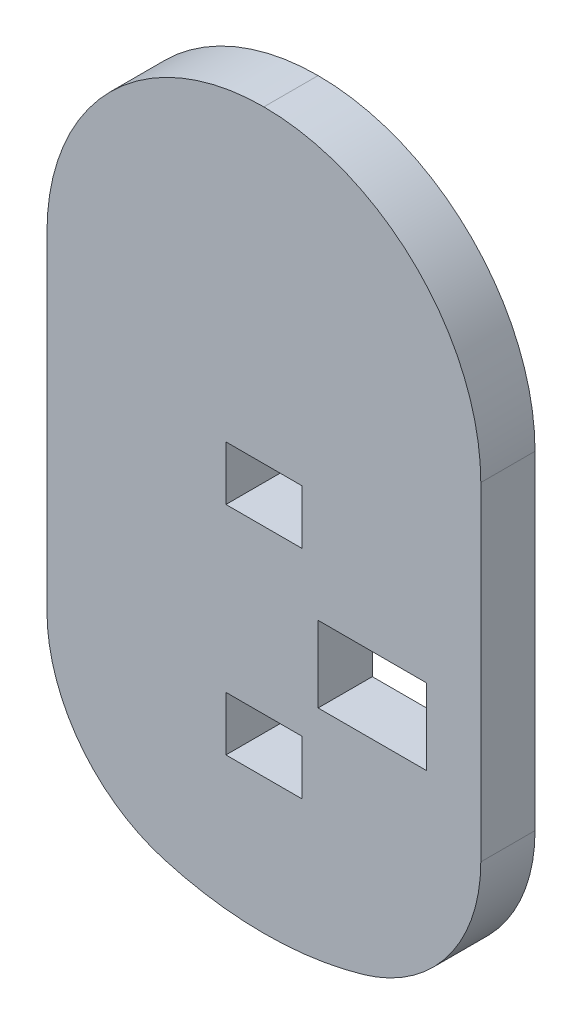
ISO-10303-21;
HEADER;
FILE_DESCRIPTION(('STEP AP214'),'2;1');
FILE_NAME('part.step','',(''),(''),'','','');
FILE_SCHEMA(('AUTOMOTIVE_DESIGN { 1 0 10303 214 1 1 1 1 }'));
ENDSEC;
DATA;
#1=APPLICATION_CONTEXT('core data for automotive mechanical design processes');
#2=APPLICATION_PROTOCOL_DEFINITION('international standard','automotive_design',2000,#1);
#3=PRODUCT_CONTEXT('',#1,'mechanical');
#4=PRODUCT('Part','Part','',(#3));
#5=PRODUCT_RELATED_PRODUCT_CATEGORY('part','',(#4));
#6=PRODUCT_DEFINITION_FORMATION('','',#4);
#7=PRODUCT_DEFINITION_CONTEXT('part definition',#1,'design');
#8=PRODUCT_DEFINITION('design','',#6,#7);
#9=PRODUCT_DEFINITION_SHAPE('','',#8);
#10=(LENGTH_UNIT() NAMED_UNIT(*) SI_UNIT(.MILLI.,.METRE.));
#11=(NAMED_UNIT(*) PLANE_ANGLE_UNIT() SI_UNIT($,.RADIAN.));
#12=(NAMED_UNIT(*) SI_UNIT($,.STERADIAN.) SOLID_ANGLE_UNIT());
#13=UNCERTAINTY_MEASURE_WITH_UNIT(LENGTH_MEASURE(1.E-05),#10,'distance_accuracy_value','');
#14=(GEOMETRIC_REPRESENTATION_CONTEXT(3) GLOBAL_UNCERTAINTY_ASSIGNED_CONTEXT((#13)) GLOBAL_UNIT_ASSIGNED_CONTEXT((#10,
#11,#12)) REPRESENTATION_CONTEXT('',''));
#15=CARTESIAN_POINT('',(0.,0.,0.));
#16=DIRECTION('',(0.,0.,1.));
#17=DIRECTION('',(1.,0.,0.));
#18=AXIS2_PLACEMENT_3D('',#15,#16,#17);
#19=CARTESIAN_POINT('',(0.,0.,5.));
#20=DIRECTION('',(0.,0.,-1.));
#21=DIRECTION('',(-1.,0.,0.));
#22=AXIS2_PLACEMENT_3D('',#19,#20,#21);
#23=CYLINDRICAL_SURFACE('',#22,33.);
#24=CARTESIAN_POINT('',(0.,0.,0.));
#25=DIRECTION('',(0.,0.,1.));
#26=DIRECTION('',(1.,0.,0.));
#27=AXIS2_PLACEMENT_3D('',#24,#25,#26);
#28=CIRCLE('',#27,33.);
#29=CARTESIAN_POINT('',(-9.16666666666666,-31.7012968539494,0.));
#30=VERTEX_POINT('',#29);
#31=CARTESIAN_POINT('',(9.16666666666668,-31.7012968539494,0.));
#32=VERTEX_POINT('',#31);
#33=EDGE_CURVE('E243',#30,#32,#28,.T.);
#34=ORIENTED_EDGE('',*,*,#33,.T.);
#35=DIRECTION('',(0.,0.,-1.));
#36=VECTOR('',#35,1.);
#37=CARTESIAN_POINT('',(9.16666666666668,-31.7012968539494,5.));
#38=LINE('',#37,#36);
#39=CARTESIAN_POINT('',(9.16666666666668,-31.7012968539494,5.));
#40=VERTEX_POINT('',#39);
#41=EDGE_CURVE('E275',#32,#40,#38,.F.);
#42=ORIENTED_EDGE('',*,*,#41,.T.);
#43=CARTESIAN_POINT('',(0.,0.,5.));
#44=DIRECTION('',(0.,0.,1.));
#45=DIRECTION('',(1.,0.,0.));
#46=AXIS2_PLACEMENT_3D('',#43,#44,#45);
#47=CIRCLE('',#46,33.);
#48=CARTESIAN_POINT('',(-9.16666666666666,-31.7012968539494,5.));
#49=VERTEX_POINT('',#48);
#50=EDGE_CURVE('E247',#49,#40,#47,.T.);
#51=ORIENTED_EDGE('',*,*,#50,.F.);
#52=DIRECTION('',(0.,0.,-1.));
#53=VECTOR('',#52,1.);
#54=CARTESIAN_POINT('',(-9.16666666666666,-31.7012968539494,5.));
#55=LINE('',#54,#53);
#56=EDGE_CURVE('E271',#49,#30,#55,.T.);
#57=ORIENTED_EDGE('',*,*,#56,.T.);
#58=EDGE_LOOP('',(#34,#42,#51,#57));
#59=FACE_BOUND('',#58,.T.);
#60=ADVANCED_FACE('F41',(#59),#23,.T.);
#61=CARTESIAN_POINT('',(0.,0.,5.));
#62=DIRECTION('',(0.,0.,1.));
#63=DIRECTION('',(1.,0.,0.));
#64=AXIS2_PLACEMENT_3D('',#61,#62,#63);
#65=PLANE('',#64);
#66=DIRECTION('',(0.,-1.,0.));
#67=VECTOR('',#66,1.);
#68=CARTESIAN_POINT('',(5.00000000000001,-5.5,5.));
#69=LINE('',#68,#67);
#70=CARTESIAN_POINT('',(5.00000000000001,-5.5,5.));
#71=VERTEX_POINT('',#70);
#72=CARTESIAN_POINT('',(5.00000000000001,-12.5,5.));
#73=VERTEX_POINT('',#72);
#74=EDGE_CURVE('E56',#71,#73,#69,.T.);
#75=ORIENTED_EDGE('',*,*,#74,.F.);
#76=DIRECTION('',(-1.,0.,0.));
#77=VECTOR('',#76,1.);
#78=CARTESIAN_POINT('',(5.00000000000001,-5.5,5.));
#79=LINE('',#78,#77);
#80=CARTESIAN_POINT('',(15.,-5.5,5.));
#81=VERTEX_POINT('',#80);
#82=EDGE_CURVE('E191',#81,#71,#79,.T.);
#83=ORIENTED_EDGE('',*,*,#82,.F.);
#84=DIRECTION('',(0.,1.,0.));
#85=VECTOR('',#84,1.);
#86=CARTESIAN_POINT('',(15.,-5.5,5.));
#87=LINE('',#86,#85);
#88=CARTESIAN_POINT('',(15.,-12.5,5.));
#89=VERTEX_POINT('',#88);
#90=EDGE_CURVE('E175',#89,#81,#87,.T.);
#91=ORIENTED_EDGE('',*,*,#90,.F.);
#92=DIRECTION('',(1.,0.,0.));
#93=VECTOR('',#92,1.);
#94=CARTESIAN_POINT('',(5.00000000000001,-12.5,5.));
#95=LINE('',#94,#93);
#96=EDGE_CURVE('E184',#73,#89,#95,.T.);
#97=ORIENTED_EDGE('',*,*,#96,.F.);
#98=EDGE_LOOP('',(#75,#83,#91,#97));
#99=FACE_BOUND('',#98,.T.);
#100=DIRECTION('',(0.,-1.,0.));
#101=VECTOR('',#100,1.);
#102=CARTESIAN_POINT('',(-3.5,4.5,5.));
#103=LINE('',#102,#101);
#104=CARTESIAN_POINT('',(-3.5,4.5,5.));
#105=VERTEX_POINT('',#104);
#106=CARTESIAN_POINT('',(-3.5,-0.5,5.));
#107=VERTEX_POINT('',#106);
#108=EDGE_CURVE('E201',#105,#107,#103,.T.);
#109=ORIENTED_EDGE('',*,*,#108,.F.);
#110=DIRECTION('',(-1.,0.,0.));
#111=VECTOR('',#110,1.);
#112=CARTESIAN_POINT('',(-3.5,4.5,5.));
#113=LINE('',#112,#111);
#114=CARTESIAN_POINT('',(3.5,4.5,5.));
#115=VERTEX_POINT('',#114);
#116=EDGE_CURVE('E210',#115,#105,#113,.T.);
#117=ORIENTED_EDGE('',*,*,#116,.F.);
#118=DIRECTION('',(0.,1.,0.));
#119=VECTOR('',#118,1.);
#120=CARTESIAN_POINT('',(3.5,4.5,5.));
#121=LINE('',#120,#119);
#122=CARTESIAN_POINT('',(3.5,-0.5,5.));
#123=VERTEX_POINT('',#122);
#124=EDGE_CURVE('E207',#123,#115,#121,.T.);
#125=ORIENTED_EDGE('',*,*,#124,.F.);
#126=DIRECTION('',(1.,0.,0.));
#127=VECTOR('',#126,1.);
#128=CARTESIAN_POINT('',(-3.5,-0.5,5.));
#129=LINE('',#128,#127);
#130=EDGE_CURVE('E203',#107,#123,#129,.T.);
#131=ORIENTED_EDGE('',*,*,#130,.F.);
#132=EDGE_LOOP('',(#109,#117,#125,#131));
#133=FACE_BOUND('',#132,.T.);
#134=DIRECTION('',(0.,-1.,0.));
#135=VECTOR('',#134,1.);
#136=CARTESIAN_POINT('',(-3.5,-15.5,5.));
#137=LINE('',#136,#135);
#138=CARTESIAN_POINT('',(-3.5,-15.5,5.));
#139=VERTEX_POINT('',#138);
#140=CARTESIAN_POINT('',(-3.5,-20.5,5.));
#141=VERTEX_POINT('',#140);
#142=EDGE_CURVE('E198',#139,#141,#137,.T.);
#143=ORIENTED_EDGE('',*,*,#142,.F.);
#144=DIRECTION('',(-1.,0.,0.));
#145=VECTOR('',#144,1.);
#146=CARTESIAN_POINT('',(-3.5,-15.5,5.));
#147=LINE('',#146,#145);
#148=CARTESIAN_POINT('',(3.5,-15.5,5.));
#149=VERTEX_POINT('',#148);
#150=EDGE_CURVE('E230',#149,#139,#147,.T.);
#151=ORIENTED_EDGE('',*,*,#150,.F.);
#152=DIRECTION('',(0.,1.,0.));
#153=VECTOR('',#152,1.);
#154=CARTESIAN_POINT('',(3.5,-15.5,5.));
#155=LINE('',#154,#153);
#156=CARTESIAN_POINT('',(3.5,-20.5,5.));
#157=VERTEX_POINT('',#156);
#158=EDGE_CURVE('E227',#157,#149,#155,.T.);
#159=ORIENTED_EDGE('',*,*,#158,.F.);
#160=DIRECTION('',(1.,0.,0.));
#161=VECTOR('',#160,1.);
#162=CARTESIAN_POINT('',(-3.5,-20.5,5.));
#163=LINE('',#162,#161);
#164=EDGE_CURVE('E224',#141,#157,#163,.T.);
#165=ORIENTED_EDGE('',*,*,#164,.F.);
#166=EDGE_LOOP('',(#143,#151,#159,#165));
#167=FACE_BOUND('',#166,.T.);
#168=ORIENTED_EDGE('',*,*,#50,.T.);
#169=CARTESIAN_POINT('',(5.00000000000001,-17.2916164657906,5.));
#170=DIRECTION('',(0.,0.,1.));
#171=DIRECTION('',(1.,0.,0.));
#172=AXIS2_PLACEMENT_3D('',#169,#170,#171);
#173=CIRCLE('',#172,15.);
#174=CARTESIAN_POINT('',(20.,-17.2916164657906,5.));
#175=VERTEX_POINT('',#174);
#176=EDGE_CURVE('E280',#40,#175,#173,.T.);
#177=ORIENTED_EDGE('',*,*,#176,.T.);
#178=DIRECTION('',(0.,-1.,0.));
#179=VECTOR('',#178,1.);
#180=CARTESIAN_POINT('',(20.,26.2488094968134,5.));
#181=LINE('',#180,#179);
#182=CARTESIAN_POINT('',(20.,13.,5.));
#183=VERTEX_POINT('',#182);
#184=EDGE_CURVE('E244',#183,#175,#181,.T.);
#185=ORIENTED_EDGE('',*,*,#184,.F.);
#186=CARTESIAN_POINT('',(0.,13.,5.));
#187=DIRECTION('',(0.,0.,1.));
#188=DIRECTION('',(1.,0.,0.));
#189=AXIS2_PLACEMENT_3D('',#186,#187,#188);
#190=CIRCLE('',#189,20.);
#191=CARTESIAN_POINT('',(0.,33.,5.));
#192=VERTEX_POINT('',#191);
#193=EDGE_CURVE('E257',#183,#192,#190,.T.);
#194=ORIENTED_EDGE('',*,*,#193,.T.);
#195=CARTESIAN_POINT('',(0.,13.,5.));
#196=DIRECTION('',(0.,0.,1.));
#197=DIRECTION('',(1.,0.,0.));
#198=AXIS2_PLACEMENT_3D('',#195,#196,#197);
#199=CIRCLE('',#198,20.);
#200=CARTESIAN_POINT('',(-20.,13.,5.));
#201=VERTEX_POINT('',#200);
#202=EDGE_CURVE('E259',#192,#201,#199,.T.);
#203=ORIENTED_EDGE('',*,*,#202,.T.);
#204=DIRECTION('',(0.,1.,0.));
#205=VECTOR('',#204,1.);
#206=CARTESIAN_POINT('',(-20.,26.2488094968134,5.));
#207=LINE('',#206,#205);
#208=CARTESIAN_POINT('',(-20.,-17.2916164657906,5.));
#209=VERTEX_POINT('',#208);
#210=EDGE_CURVE('E241',#209,#201,#207,.T.);
#211=ORIENTED_EDGE('',*,*,#210,.F.);
#212=CARTESIAN_POINT('',(-5.,-17.2916164657906,5.));
#213=DIRECTION('',(0.,0.,1.));
#214=DIRECTION('',(1.,0.,0.));
#215=AXIS2_PLACEMENT_3D('',#212,#213,#214);
#216=CIRCLE('',#215,15.);
#217=EDGE_CURVE('E278',#209,#49,#216,.T.);
#218=ORIENTED_EDGE('',*,*,#217,.T.);
#219=EDGE_LOOP('',(#168,#177,#185,#194,#203,#211,#218));
#220=FACE_BOUND('',#219,.T.);
#221=ADVANCED_FACE('F188',(#99,#133,#167,#220),#65,.T.);
#222=CARTESIAN_POINT('',(0.,0.,0.));
#223=DIRECTION('',(0.,0.,1.));
#224=DIRECTION('',(1.,0.,0.));
#225=AXIS2_PLACEMENT_3D('',#222,#223,#224);
#226=PLANE('',#225);
#227=DIRECTION('',(-1.,0.,0.));
#228=VECTOR('',#227,1.);
#229=CARTESIAN_POINT('',(0.,-5.5,0.));
#230=LINE('',#229,#228);
#231=CARTESIAN_POINT('',(15.,-5.5,0.));
#232=VERTEX_POINT('',#231);
#233=CARTESIAN_POINT('',(5.00000000000001,-5.5,0.));
#234=VERTEX_POINT('',#233);
#235=EDGE_CURVE('E49',#232,#234,#230,.T.);
#236=ORIENTED_EDGE('',*,*,#235,.T.);
#237=DIRECTION('',(0.,-1.,0.));
#238=VECTOR('',#237,1.);
#239=CARTESIAN_POINT('',(5.00000000000001,0.,0.));
#240=LINE('',#239,#238);
#241=CARTESIAN_POINT('',(5.00000000000001,-12.5,0.));
#242=VERTEX_POINT('',#241);
#243=EDGE_CURVE('E11',#234,#242,#240,.T.);
#244=ORIENTED_EDGE('',*,*,#243,.T.);
#245=DIRECTION('',(1.,0.,0.));
#246=VECTOR('',#245,1.);
#247=CARTESIAN_POINT('',(0.,-12.5,0.));
#248=LINE('',#247,#246);
#249=CARTESIAN_POINT('',(15.,-12.5,0.));
#250=VERTEX_POINT('',#249);
#251=EDGE_CURVE('E315',#242,#250,#248,.T.);
#252=ORIENTED_EDGE('',*,*,#251,.T.);
#253=DIRECTION('',(0.,1.,0.));
#254=VECTOR('',#253,1.);
#255=CARTESIAN_POINT('',(15.,0.,0.));
#256=LINE('',#255,#254);
#257=EDGE_CURVE('E178',#250,#232,#256,.T.);
#258=ORIENTED_EDGE('',*,*,#257,.T.);
#259=EDGE_LOOP('',(#236,#244,#252,#258));
#260=FACE_BOUND('',#259,.T.);
#261=DIRECTION('',(-1.,0.,0.));
#262=VECTOR('',#261,1.);
#263=CARTESIAN_POINT('',(0.,4.5,0.));
#264=LINE('',#263,#262);
#265=CARTESIAN_POINT('',(3.5,4.5,0.));
#266=VERTEX_POINT('',#265);
#267=CARTESIAN_POINT('',(-3.5,4.5,0.));
#268=VERTEX_POINT('',#267);
#269=EDGE_CURVE('E309',#266,#268,#264,.T.);
#270=ORIENTED_EDGE('',*,*,#269,.T.);
#271=DIRECTION('',(0.,-1.,0.));
#272=VECTOR('',#271,1.);
#273=CARTESIAN_POINT('',(-3.5,0.,0.));
#274=LINE('',#273,#272);
#275=CARTESIAN_POINT('',(-3.5,-0.5,0.));
#276=VERTEX_POINT('',#275);
#277=EDGE_CURVE('E312',#268,#276,#274,.T.);
#278=ORIENTED_EDGE('',*,*,#277,.T.);
#279=DIRECTION('',(1.,0.,0.));
#280=VECTOR('',#279,1.);
#281=CARTESIAN_POINT('',(0.,-0.5,0.));
#282=LINE('',#281,#280);
#283=CARTESIAN_POINT('',(3.5,-0.5,0.));
#284=VERTEX_POINT('',#283);
#285=EDGE_CURVE('E303',#276,#284,#282,.T.);
#286=ORIENTED_EDGE('',*,*,#285,.T.);
#287=DIRECTION('',(0.,1.,0.));
#288=VECTOR('',#287,1.);
#289=CARTESIAN_POINT('',(3.5,0.,0.));
#290=LINE('',#289,#288);
#291=EDGE_CURVE('E306',#284,#266,#290,.T.);
#292=ORIENTED_EDGE('',*,*,#291,.T.);
#293=EDGE_LOOP('',(#270,#278,#286,#292));
#294=FACE_BOUND('',#293,.T.);
#295=DIRECTION('',(-1.,0.,0.));
#296=VECTOR('',#295,1.);
#297=CARTESIAN_POINT('',(0.,-15.5,0.));
#298=LINE('',#297,#296);
#299=CARTESIAN_POINT('',(3.5,-15.5,0.));
#300=VERTEX_POINT('',#299);
#301=CARTESIAN_POINT('',(-3.5,-15.5,0.));
#302=VERTEX_POINT('',#301);
#303=EDGE_CURVE('E297',#300,#302,#298,.T.);
#304=ORIENTED_EDGE('',*,*,#303,.T.);
#305=DIRECTION('',(0.,-1.,0.));
#306=VECTOR('',#305,1.);
#307=CARTESIAN_POINT('',(-3.5,0.,0.));
#308=LINE('',#307,#306);
#309=CARTESIAN_POINT('',(-3.5,-20.5,0.));
#310=VERTEX_POINT('',#309);
#311=EDGE_CURVE('E300',#302,#310,#308,.T.);
#312=ORIENTED_EDGE('',*,*,#311,.T.);
#313=DIRECTION('',(1.,0.,0.));
#314=VECTOR('',#313,1.);
#315=CARTESIAN_POINT('',(0.,-20.5,0.));
#316=LINE('',#315,#314);
#317=CARTESIAN_POINT('',(3.5,-20.5,0.));
#318=VERTEX_POINT('',#317);
#319=EDGE_CURVE('E291',#310,#318,#316,.T.);
#320=ORIENTED_EDGE('',*,*,#319,.T.);
#321=DIRECTION('',(0.,1.,0.));
#322=VECTOR('',#321,1.);
#323=CARTESIAN_POINT('',(3.5,0.,0.));
#324=LINE('',#323,#322);
#325=EDGE_CURVE('E294',#318,#300,#324,.T.);
#326=ORIENTED_EDGE('',*,*,#325,.T.);
#327=EDGE_LOOP('',(#304,#312,#320,#326));
#328=FACE_BOUND('',#327,.T.);
#329=DIRECTION('',(0.,-1.,0.));
#330=VECTOR('',#329,1.);
#331=CARTESIAN_POINT('',(20.,0.,0.));
#332=LINE('',#331,#330);
#333=CARTESIAN_POINT('',(20.,13.,0.));
#334=VERTEX_POINT('',#333);
#335=CARTESIAN_POINT('',(20.,-17.2916164657906,0.));
#336=VERTEX_POINT('',#335);
#337=EDGE_CURVE('E250',#334,#336,#332,.T.);
#338=ORIENTED_EDGE('',*,*,#337,.T.);
#339=CARTESIAN_POINT('',(5.00000000000001,-17.2916164657906,0.));
#340=DIRECTION('',(0.,0.,1.));
#341=DIRECTION('',(1.,0.,0.));
#342=AXIS2_PLACEMENT_3D('',#339,#340,#341);
#343=CIRCLE('',#342,15.);
#344=EDGE_CURVE('E286',#336,#32,#343,.F.);
#345=ORIENTED_EDGE('',*,*,#344,.T.);
#346=ORIENTED_EDGE('',*,*,#33,.F.);
#347=CARTESIAN_POINT('',(-5.,-17.2916164657906,0.));
#348=DIRECTION('',(0.,0.,1.));
#349=DIRECTION('',(1.,0.,0.));
#350=AXIS2_PLACEMENT_3D('',#347,#348,#349);
#351=CIRCLE('',#350,15.);
#352=CARTESIAN_POINT('',(-20.,-17.2916164657906,0.));
#353=VERTEX_POINT('',#352);
#354=EDGE_CURVE('E284',#30,#353,#351,.F.);
#355=ORIENTED_EDGE('',*,*,#354,.T.);
#356=DIRECTION('',(0.,1.,0.));
#357=VECTOR('',#356,1.);
#358=CARTESIAN_POINT('',(-20.,0.,0.));
#359=LINE('',#358,#357);
#360=CARTESIAN_POINT('',(-20.,13.,0.));
#361=VERTEX_POINT('',#360);
#362=EDGE_CURVE('E255',#353,#361,#359,.T.);
#363=ORIENTED_EDGE('',*,*,#362,.T.);
#364=CARTESIAN_POINT('',(0.,13.,0.));
#365=DIRECTION('',(0.,0.,1.));
#366=DIRECTION('',(1.,0.,0.));
#367=AXIS2_PLACEMENT_3D('',#364,#365,#366);
#368=CIRCLE('',#367,20.);
#369=CARTESIAN_POINT('',(0.,33.,0.));
#370=VERTEX_POINT('',#369);
#371=EDGE_CURVE('E267',#361,#370,#368,.F.);
#372=ORIENTED_EDGE('',*,*,#371,.T.);
#373=CARTESIAN_POINT('',(0.,13.,0.));
#374=DIRECTION('',(0.,0.,1.));
#375=DIRECTION('',(1.,0.,0.));
#376=AXIS2_PLACEMENT_3D('',#373,#374,#375);
#377=CIRCLE('',#376,20.);
#378=EDGE_CURVE('E265',#370,#334,#377,.F.);
#379=ORIENTED_EDGE('',*,*,#378,.T.);
#380=EDGE_LOOP('',(#338,#345,#346,#355,#363,#372,#379));
#381=FACE_BOUND('',#380,.T.);
#382=ADVANCED_FACE('F319',(#260,#294,#328,#381),#226,.F.);
#383=CARTESIAN_POINT('',(20.,26.2488094968134,-5.));
#384=DIRECTION('',(-1.,0.,0.));
#385=DIRECTION('',(0.,0.,1.));
#386=AXIS2_PLACEMENT_3D('',#383,#384,#385);
#387=PLANE('',#386);
#388=ORIENTED_EDGE('',*,*,#184,.T.);
#389=DIRECTION('',(0.,0.,-1.));
#390=VECTOR('',#389,1.);
#391=CARTESIAN_POINT('',(20.,-17.2916164657906,-5.));
#392=LINE('',#391,#390);
#393=EDGE_CURVE('E282',#175,#336,#392,.T.);
#394=ORIENTED_EDGE('',*,*,#393,.T.);
#395=ORIENTED_EDGE('',*,*,#337,.F.);
#396=DIRECTION('',(0.,0.,-1.));
#397=VECTOR('',#396,1.);
#398=CARTESIAN_POINT('',(20.,13.,-5.));
#399=LINE('',#398,#397);
#400=EDGE_CURVE('E269',#334,#183,#399,.F.);
#401=ORIENTED_EDGE('',*,*,#400,.T.);
#402=EDGE_LOOP('',(#388,#394,#395,#401));
#403=FACE_BOUND('',#402,.T.);
#404=ADVANCED_FACE('F385',(#403),#387,.F.);
#405=CARTESIAN_POINT('',(-20.,26.2488094968134,-5.));
#406=DIRECTION('',(1.,0.,0.));
#407=DIRECTION('',(0.,0.,-1.));
#408=AXIS2_PLACEMENT_3D('',#405,#406,#407);
#409=PLANE('',#408);
#410=ORIENTED_EDGE('',*,*,#362,.F.);
#411=DIRECTION('',(0.,0.,-1.));
#412=VECTOR('',#411,1.);
#413=CARTESIAN_POINT('',(-20.,-17.2916164657906,-5.));
#414=LINE('',#413,#412);
#415=EDGE_CURVE('E288',#353,#209,#414,.F.);
#416=ORIENTED_EDGE('',*,*,#415,.T.);
#417=ORIENTED_EDGE('',*,*,#210,.T.);
#418=DIRECTION('',(0.,0.,-1.));
#419=VECTOR('',#418,1.);
#420=CARTESIAN_POINT('',(-20.,13.,-5.));
#421=LINE('',#420,#419);
#422=EDGE_CURVE('E262',#201,#361,#421,.T.);
#423=ORIENTED_EDGE('',*,*,#422,.T.);
#424=EDGE_LOOP('',(#410,#416,#417,#423));
#425=FACE_BOUND('',#424,.T.);
#426=ADVANCED_FACE('F354',(#425),#409,.F.);
#427=CARTESIAN_POINT('',(0.,13.,5.));
#428=DIRECTION('',(0.,0.,-1.));
#429=DIRECTION('',(-1.,0.,0.));
#430=AXIS2_PLACEMENT_3D('',#427,#428,#429);
#431=CYLINDRICAL_SURFACE('',#430,20.);
#432=ORIENTED_EDGE('',*,*,#400,.F.);
#433=ORIENTED_EDGE('',*,*,#378,.F.);
#434=DIRECTION('',(0.,0.,-1.));
#435=VECTOR('',#434,1.);
#436=CARTESIAN_POINT('',(0.,33.,5.));
#437=LINE('',#436,#435);
#438=EDGE_CURVE('E216',#192,#370,#437,.T.);
#439=ORIENTED_EDGE('',*,*,#438,.F.);
#440=ORIENTED_EDGE('',*,*,#193,.F.);
#441=EDGE_LOOP('',(#432,#433,#439,#440));
#442=FACE_BOUND('',#441,.T.);
#443=ADVANCED_FACE('F351',(#442),#431,.T.);
#444=CARTESIAN_POINT('',(0.,13.,5.));
#445=DIRECTION('',(0.,0.,-1.));
#446=DIRECTION('',(-1.,0.,0.));
#447=AXIS2_PLACEMENT_3D('',#444,#445,#446);
#448=CYLINDRICAL_SURFACE('',#447,20.);
#449=ORIENTED_EDGE('',*,*,#371,.F.);
#450=ORIENTED_EDGE('',*,*,#422,.F.);
#451=ORIENTED_EDGE('',*,*,#202,.F.);
#452=ORIENTED_EDGE('',*,*,#438,.T.);
#453=EDGE_LOOP('',(#449,#450,#451,#452));
#454=FACE_BOUND('',#453,.T.);
#455=ADVANCED_FACE('F347',(#454),#448,.T.);
#456=CARTESIAN_POINT('',(5.00000000000001,-17.2916164657906,5.));
#457=DIRECTION('',(0.,0.,-1.));
#458=DIRECTION('',(-1.,0.,0.));
#459=AXIS2_PLACEMENT_3D('',#456,#457,#458);
#460=CYLINDRICAL_SURFACE('',#459,15.);
#461=ORIENTED_EDGE('',*,*,#344,.F.);
#462=ORIENTED_EDGE('',*,*,#393,.F.);
#463=ORIENTED_EDGE('',*,*,#176,.F.);
#464=ORIENTED_EDGE('',*,*,#41,.F.);
#465=EDGE_LOOP('',(#461,#462,#463,#464));
#466=FACE_BOUND('',#465,.T.);
#467=ADVANCED_FACE('F350',(#466),#460,.T.);
#468=CARTESIAN_POINT('',(-5.,-17.2916164657906,5.));
#469=DIRECTION('',(0.,0.,-1.));
#470=DIRECTION('',(-1.,0.,0.));
#471=AXIS2_PLACEMENT_3D('',#468,#469,#470);
#472=CYLINDRICAL_SURFACE('',#471,15.);
#473=ORIENTED_EDGE('',*,*,#354,.F.);
#474=ORIENTED_EDGE('',*,*,#56,.F.);
#475=ORIENTED_EDGE('',*,*,#217,.F.);
#476=ORIENTED_EDGE('',*,*,#415,.F.);
#477=EDGE_LOOP('',(#473,#474,#475,#476));
#478=FACE_BOUND('',#477,.T.);
#479=ADVANCED_FACE('F43',(#478),#472,.T.);
#480=CARTESIAN_POINT('',(-3.5,-15.5,-5.));
#481=DIRECTION('',(-1.,0.,0.));
#482=DIRECTION('',(0.,-1.,0.));
#483=AXIS2_PLACEMENT_3D('',#480,#481,#482);
#484=PLANE('',#483);
#485=DIRECTION('',(0.,0.,1.));
#486=VECTOR('',#485,1.);
#487=CARTESIAN_POINT('',(-3.5,-15.5,-5.));
#488=LINE('',#487,#486);
#489=EDGE_CURVE('E204',#302,#139,#488,.T.);
#490=ORIENTED_EDGE('',*,*,#489,.T.);
#491=ORIENTED_EDGE('',*,*,#142,.T.);
#492=DIRECTION('',(0.,0.,1.));
#493=VECTOR('',#492,1.);
#494=CARTESIAN_POINT('',(-3.5,-20.5,-5.));
#495=LINE('',#494,#493);
#496=EDGE_CURVE('E233',#310,#141,#495,.T.);
#497=ORIENTED_EDGE('',*,*,#496,.F.);
#498=ORIENTED_EDGE('',*,*,#311,.F.);
#499=EDGE_LOOP('',(#490,#491,#497,#498));
#500=FACE_BOUND('',#499,.T.);
#501=ADVANCED_FACE('F361',(#500),#484,.F.);
#502=CARTESIAN_POINT('',(-3.5,-15.5,-5.));
#503=DIRECTION('',(0.,1.,0.));
#504=DIRECTION('',(0.,0.,1.));
#505=AXIS2_PLACEMENT_3D('',#502,#503,#504);
#506=PLANE('',#505);
#507=DIRECTION('',(0.,0.,1.));
#508=VECTOR('',#507,1.);
#509=CARTESIAN_POINT('',(3.5,-15.5,-5.));
#510=LINE('',#509,#508);
#511=EDGE_CURVE('E235',#300,#149,#510,.T.);
#512=ORIENTED_EDGE('',*,*,#511,.T.);
#513=ORIENTED_EDGE('',*,*,#150,.T.);
#514=ORIENTED_EDGE('',*,*,#489,.F.);
#515=ORIENTED_EDGE('',*,*,#303,.F.);
#516=EDGE_LOOP('',(#512,#513,#514,#515));
#517=FACE_BOUND('',#516,.T.);
#518=ADVANCED_FACE('F397',(#517),#506,.F.);
#519=CARTESIAN_POINT('',(3.5,-15.5,-5.));
#520=DIRECTION('',(1.,0.,0.));
#521=DIRECTION('',(0.,1.,0.));
#522=AXIS2_PLACEMENT_3D('',#519,#520,#521);
#523=PLANE('',#522);
#524=DIRECTION('',(0.,0.,1.));
#525=VECTOR('',#524,1.);
#526=CARTESIAN_POINT('',(3.5,-20.5,-5.));
#527=LINE('',#526,#525);
#528=EDGE_CURVE('E237',#318,#157,#527,.T.);
#529=ORIENTED_EDGE('',*,*,#528,.T.);
#530=ORIENTED_EDGE('',*,*,#158,.T.);
#531=ORIENTED_EDGE('',*,*,#511,.F.);
#532=ORIENTED_EDGE('',*,*,#325,.F.);
#533=EDGE_LOOP('',(#529,#530,#531,#532));
#534=FACE_BOUND('',#533,.T.);
#535=ADVANCED_FACE('F403',(#534),#523,.F.);
#536=CARTESIAN_POINT('',(-3.5,-20.5,-5.));
#537=DIRECTION('',(0.,-1.,0.));
#538=DIRECTION('',(0.,0.,-1.));
#539=AXIS2_PLACEMENT_3D('',#536,#537,#538);
#540=PLANE('',#539);
#541=ORIENTED_EDGE('',*,*,#496,.T.);
#542=ORIENTED_EDGE('',*,*,#164,.T.);
#543=ORIENTED_EDGE('',*,*,#528,.F.);
#544=ORIENTED_EDGE('',*,*,#319,.F.);
#545=EDGE_LOOP('',(#541,#542,#543,#544));
#546=FACE_BOUND('',#545,.T.);
#547=ADVANCED_FACE('F399',(#546),#540,.F.);
#548=CARTESIAN_POINT('',(-3.5,4.5,-5.));
#549=DIRECTION('',(-1.,0.,0.));
#550=DIRECTION('',(0.,0.,1.));
#551=AXIS2_PLACEMENT_3D('',#548,#549,#550);
#552=PLANE('',#551);
#553=DIRECTION('',(0.,0.,1.));
#554=VECTOR('',#553,1.);
#555=CARTESIAN_POINT('',(-3.5,4.5,-5.));
#556=LINE('',#555,#554);
#557=EDGE_CURVE('E214',#268,#105,#556,.T.);
#558=ORIENTED_EDGE('',*,*,#557,.T.);
#559=ORIENTED_EDGE('',*,*,#108,.T.);
#560=DIRECTION('',(0.,0.,1.));
#561=VECTOR('',#560,1.);
#562=CARTESIAN_POINT('',(-3.5,-0.5,-5.));
#563=LINE('',#562,#561);
#564=EDGE_CURVE('E213',#276,#107,#563,.T.);
#565=ORIENTED_EDGE('',*,*,#564,.F.);
#566=ORIENTED_EDGE('',*,*,#277,.F.);
#567=EDGE_LOOP('',(#558,#559,#565,#566));
#568=FACE_BOUND('',#567,.T.);
#569=ADVANCED_FACE('F402',(#568),#552,.F.);
#570=CARTESIAN_POINT('',(-3.5,4.5,-5.));
#571=DIRECTION('',(0.,1.,0.));
#572=DIRECTION('',(0.,0.,1.));
#573=AXIS2_PLACEMENT_3D('',#570,#571,#572);
#574=PLANE('',#573);
#575=DIRECTION('',(0.,0.,1.));
#576=VECTOR('',#575,1.);
#577=CARTESIAN_POINT('',(3.5,4.5,-5.));
#578=LINE('',#577,#576);
#579=EDGE_CURVE('E217',#266,#115,#578,.T.);
#580=ORIENTED_EDGE('',*,*,#579,.T.);
#581=ORIENTED_EDGE('',*,*,#116,.T.);
#582=ORIENTED_EDGE('',*,*,#557,.F.);
#583=ORIENTED_EDGE('',*,*,#269,.F.);
#584=EDGE_LOOP('',(#580,#581,#582,#583));
#585=FACE_BOUND('',#584,.T.);
#586=ADVANCED_FACE('F412',(#585),#574,.F.);
#587=CARTESIAN_POINT('',(3.5,4.5,-5.));
#588=DIRECTION('',(1.,0.,0.));
#589=DIRECTION('',(0.,0.,-1.));
#590=AXIS2_PLACEMENT_3D('',#587,#588,#589);
#591=PLANE('',#590);
#592=DIRECTION('',(0.,0.,1.));
#593=VECTOR('',#592,1.);
#594=CARTESIAN_POINT('',(3.5,-0.5,-5.));
#595=LINE('',#594,#593);
#596=EDGE_CURVE('E219',#284,#123,#595,.T.);
#597=ORIENTED_EDGE('',*,*,#596,.T.);
#598=ORIENTED_EDGE('',*,*,#124,.T.);
#599=ORIENTED_EDGE('',*,*,#579,.F.);
#600=ORIENTED_EDGE('',*,*,#291,.F.);
#601=EDGE_LOOP('',(#597,#598,#599,#600));
#602=FACE_BOUND('',#601,.T.);
#603=ADVANCED_FACE('F333',(#602),#591,.F.);
#604=CARTESIAN_POINT('',(-3.5,-0.5,-5.));
#605=DIRECTION('',(0.,-1.,0.));
#606=DIRECTION('',(0.,0.,-1.));
#607=AXIS2_PLACEMENT_3D('',#604,#605,#606);
#608=PLANE('',#607);
#609=ORIENTED_EDGE('',*,*,#564,.T.);
#610=ORIENTED_EDGE('',*,*,#130,.T.);
#611=ORIENTED_EDGE('',*,*,#596,.F.);
#612=ORIENTED_EDGE('',*,*,#285,.F.);
#613=EDGE_LOOP('',(#609,#610,#611,#612));
#614=FACE_BOUND('',#613,.T.);
#615=ADVANCED_FACE('F326',(#614),#608,.F.);
#616=CARTESIAN_POINT('',(5.00000000000001,-5.5,-5.));
#617=DIRECTION('',(-1.,0.,0.));
#618=DIRECTION('',(0.,0.,1.));
#619=AXIS2_PLACEMENT_3D('',#616,#617,#618);
#620=PLANE('',#619);
#621=DIRECTION('',(0.,0.,1.));
#622=VECTOR('',#621,1.);
#623=CARTESIAN_POINT('',(5.00000000000001,-5.5,-5.));
#624=LINE('',#623,#622);
#625=EDGE_CURVE('E196',#234,#71,#624,.T.);
#626=ORIENTED_EDGE('',*,*,#625,.T.);
#627=ORIENTED_EDGE('',*,*,#74,.T.);
#628=DIRECTION('',(0.,0.,1.));
#629=VECTOR('',#628,1.);
#630=CARTESIAN_POINT('',(5.00000000000001,-12.5,-5.));
#631=LINE('',#630,#629);
#632=EDGE_CURVE('E181',#242,#73,#631,.T.);
#633=ORIENTED_EDGE('',*,*,#632,.F.);
#634=ORIENTED_EDGE('',*,*,#243,.F.);
#635=EDGE_LOOP('',(#626,#627,#633,#634));
#636=FACE_BOUND('',#635,.T.);
#637=ADVANCED_FACE('F324',(#636),#620,.F.);
#638=CARTESIAN_POINT('',(5.00000000000001,-5.5,-5.));
#639=DIRECTION('',(0.,1.,0.));
#640=DIRECTION('',(-1.,0.,0.));
#641=AXIS2_PLACEMENT_3D('',#638,#639,#640);
#642=PLANE('',#641);
#643=DIRECTION('',(0.,0.,1.));
#644=VECTOR('',#643,1.);
#645=CARTESIAN_POINT('',(15.,-5.5,-5.));
#646=LINE('',#645,#644);
#647=EDGE_CURVE('E180',#232,#81,#646,.T.);
#648=ORIENTED_EDGE('',*,*,#647,.T.);
#649=ORIENTED_EDGE('',*,*,#82,.T.);
#650=ORIENTED_EDGE('',*,*,#625,.F.);
#651=ORIENTED_EDGE('',*,*,#235,.F.);
#652=EDGE_LOOP('',(#648,#649,#650,#651));
#653=FACE_BOUND('',#652,.T.);
#654=ADVANCED_FACE('F323',(#653),#642,.F.);
#655=CARTESIAN_POINT('',(15.,-5.5,-5.));
#656=DIRECTION('',(1.,0.,0.));
#657=DIRECTION('',(0.,0.,-1.));
#658=AXIS2_PLACEMENT_3D('',#655,#656,#657);
#659=PLANE('',#658);
#660=DIRECTION('',(0.,0.,1.));
#661=VECTOR('',#660,1.);
#662=CARTESIAN_POINT('',(15.,-12.5,-5.));
#663=LINE('',#662,#661);
#664=EDGE_CURVE('E64',#250,#89,#663,.T.);
#665=ORIENTED_EDGE('',*,*,#664,.T.);
#666=ORIENTED_EDGE('',*,*,#90,.T.);
#667=ORIENTED_EDGE('',*,*,#647,.F.);
#668=ORIENTED_EDGE('',*,*,#257,.F.);
#669=EDGE_LOOP('',(#665,#666,#667,#668));
#670=FACE_BOUND('',#669,.T.);
#671=ADVANCED_FACE('F172',(#670),#659,.F.);
#672=CARTESIAN_POINT('',(5.00000000000001,-12.5,-5.));
#673=DIRECTION('',(0.,-1.,0.));
#674=DIRECTION('',(0.,0.,-1.));
#675=AXIS2_PLACEMENT_3D('',#672,#673,#674);
#676=PLANE('',#675);
#677=ORIENTED_EDGE('',*,*,#632,.T.);
#678=ORIENTED_EDGE('',*,*,#96,.T.);
#679=ORIENTED_EDGE('',*,*,#664,.F.);
#680=ORIENTED_EDGE('',*,*,#251,.F.);
#681=EDGE_LOOP('',(#677,#678,#679,#680));
#682=FACE_BOUND('',#681,.T.);
#683=ADVANCED_FACE('F185',(#682),#676,.F.);
#684=CLOSED_SHELL('',(#60,#221,#382,#404,#426,#443,#455,#467,#479,#501,#518,#535,#547,#569,#586,
#603,#615,#637,#654,#671,#683));
#685=MANIFOLD_SOLID_BREP('B2',#684);
#686=ADVANCED_BREP_SHAPE_REPRESENTATION('',(#18,#685),#14);
#687=SHAPE_DEFINITION_REPRESENTATION(#9,#686);
ENDSEC;
END-ISO-10303-21;
